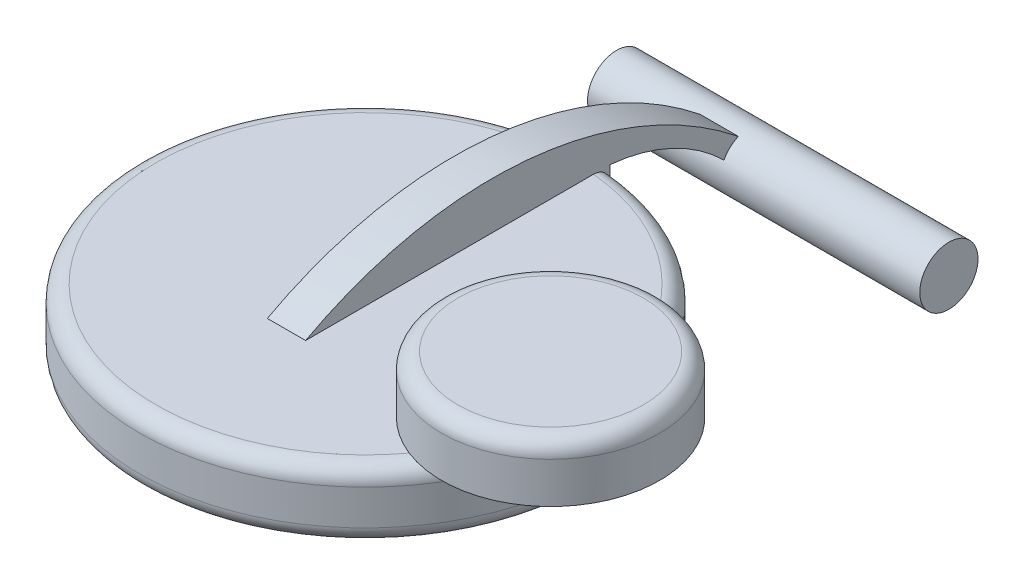
ISO-10303-21;
HEADER;
FILE_DESCRIPTION(('STEP AP214'),'2;1');
FILE_NAME('part.step','',(''),(''),'','','');
FILE_SCHEMA(('AUTOMOTIVE_DESIGN { 1 0 10303 214 1 1 1 1 }'));
ENDSEC;
DATA;
#1=APPLICATION_CONTEXT('core data for automotive mechanical design processes');
#2=APPLICATION_PROTOCOL_DEFINITION('international standard','automotive_design',2000,#1);
#3=PRODUCT_CONTEXT('',#1,'mechanical');
#4=PRODUCT('Part','Part','',(#3));
#5=PRODUCT_RELATED_PRODUCT_CATEGORY('part','',(#4));
#6=PRODUCT_DEFINITION_FORMATION('','',#4);
#7=PRODUCT_DEFINITION_CONTEXT('part definition',#1,'design');
#8=PRODUCT_DEFINITION('design','',#6,#7);
#9=PRODUCT_DEFINITION_SHAPE('','',#8);
#10=(LENGTH_UNIT() NAMED_UNIT(*) SI_UNIT(.MILLI.,.METRE.));
#11=(NAMED_UNIT(*) PLANE_ANGLE_UNIT() SI_UNIT($,.RADIAN.));
#12=(NAMED_UNIT(*) SI_UNIT($,.STERADIAN.) SOLID_ANGLE_UNIT());
#13=UNCERTAINTY_MEASURE_WITH_UNIT(LENGTH_MEASURE(1.E-05),#10,'distance_accuracy_value','');
#14=(GEOMETRIC_REPRESENTATION_CONTEXT(3) GLOBAL_UNCERTAINTY_ASSIGNED_CONTEXT((#13)) GLOBAL_UNIT_ASSIGNED_CONTEXT((#10,
#11,#12)) REPRESENTATION_CONTEXT('',''));
#15=CARTESIAN_POINT('',(0.,0.,0.));
#16=DIRECTION('',(0.,0.,1.));
#17=DIRECTION('',(1.,0.,0.));
#18=AXIS2_PLACEMENT_3D('',#15,#16,#17);
#19=CARTESIAN_POINT('',(10.3378,5.1562,34.4932));
#20=DIRECTION('',(0.,1.,0.));
#21=DIRECTION('',(0.,0.,1.));
#22=AXIS2_PLACEMENT_3D('',#19,#20,#21);
#23=PLANE('',#22);
#24=CARTESIAN_POINT('',(8.8519,5.1562,28.3464));
#25=DIRECTION('',(0.,-1.,0.));
#26=DIRECTION('',(0.,0.,-1.));
#27=AXIS2_PLACEMENT_3D('',#24,#25,#26);
#28=CIRCLE('',#27,17.5514);
#29=CARTESIAN_POINT('',(7.366,5.1562,10.8580111905642));
#30=VERTEX_POINT('',#29);
#31=CARTESIAN_POINT('',(8.8519,5.1562,10.795));
#32=VERTEX_POINT('',#31);
#33=EDGE_CURVE('E127',#30,#32,#28,.T.);
#34=ORIENTED_EDGE('',*,*,#33,.F.);
#35=DIRECTION('',(0.,0.,-1.));
#36=VECTOR('',#35,1.);
#37=CARTESIAN_POINT('',(7.366,5.1562,34.4932));
#38=LINE('',#37,#36);
#39=CARTESIAN_POINT('',(7.366,5.1562,10.795));
#40=VERTEX_POINT('',#39);
#41=EDGE_CURVE('E155',#30,#40,#38,.T.);
#42=ORIENTED_EDGE('',*,*,#41,.T.);
#43=DIRECTION('',(-1.,0.,0.));
#44=VECTOR('',#43,1.);
#45=CARTESIAN_POINT('',(10.3378,5.1562,10.795));
#46=LINE('',#45,#44);
#47=EDGE_CURVE('E152',#32,#40,#46,.T.);
#48=ORIENTED_EDGE('',*,*,#47,.F.);
#49=EDGE_LOOP('',(#34,#42,#48));
#50=FACE_BOUND('',#49,.T.);
#51=ADVANCED_FACE('F39',(#50),#23,.F.);
#52=CARTESIAN_POINT('',(25.8064,0.,0.));
#53=DIRECTION('',(-1.,0.,0.));
#54=DIRECTION('',(0.,0.,1.));
#55=AXIS2_PLACEMENT_3D('',#52,#53,#54);
#56=CYLINDRICAL_SURFACE('',#55,2.2606);
#57=CARTESIAN_POINT('',(0.,0.,0.));
#58=DIRECTION('',(1.,0.,0.));
#59=DIRECTION('',(0.,0.,-1.));
#60=AXIS2_PLACEMENT_3D('',#57,#58,#59);
#61=CIRCLE('',#60,2.2606);
#62=CARTESIAN_POINT('',(0.,0.,-2.2606));
#63=VERTEX_POINT('',#62);
#64=EDGE_CURVE('E170',#63,#63,#61,.T.);
#65=ORIENTED_EDGE('',*,*,#64,.T.);
#66=EDGE_LOOP('',(#65));
#67=FACE_BOUND('',#66,.T.);
#68=CARTESIAN_POINT('',(25.8064,0.,0.));
#69=DIRECTION('',(1.,0.,0.));
#70=DIRECTION('',(0.,0.,-1.));
#71=AXIS2_PLACEMENT_3D('',#68,#69,#70);
#72=CIRCLE('',#71,2.2606);
#73=CARTESIAN_POINT('',(25.8064,0.,-2.2606));
#74=VERTEX_POINT('',#73);
#75=EDGE_CURVE('E171',#74,#74,#72,.T.);
#76=ORIENTED_EDGE('',*,*,#75,.F.);
#77=EDGE_LOOP('',(#76));
#78=FACE_BOUND('',#77,.T.);
#79=CARTESIAN_POINT('',(10.3378,0.,0.));
#80=DIRECTION('',(-1.,0.,0.));
#81=DIRECTION('',(0.,0.,1.));
#82=AXIS2_PLACEMENT_3D('',#79,#80,#81);
#83=CIRCLE('',#82,2.2606);
#84=CARTESIAN_POINT('',(10.3378,1.04595876330423,2.00406652221604));
#85=VERTEX_POINT('',#84);
#86=CARTESIAN_POINT('',(10.3378,2.08055136158751,0.884091845792308));
#87=VERTEX_POINT('',#86);
#88=EDGE_CURVE('E189',#85,#87,#83,.T.);
#89=ORIENTED_EDGE('',*,*,#88,.F.);
#90=DIRECTION('',(-1.,0.,0.));
#91=VECTOR('',#90,1.);
#92=CARTESIAN_POINT('',(8.8519,1.04595876330423,2.00406652221604));
#93=LINE('',#92,#91);
#94=CARTESIAN_POINT('',(7.366,1.04595876330423,2.00406652221604));
#95=VERTEX_POINT('',#94);
#96=EDGE_CURVE('E182',#95,#85,#93,.F.);
#97=ORIENTED_EDGE('',*,*,#96,.F.);
#98=CARTESIAN_POINT('',(7.366,0.,0.));
#99=DIRECTION('',(-1.,0.,0.));
#100=DIRECTION('',(0.,0.,1.));
#101=AXIS2_PLACEMENT_3D('',#98,#99,#100);
#102=CIRCLE('',#101,2.2606);
#103=CARTESIAN_POINT('',(7.366,2.08055136158751,0.884091845792308));
#104=VERTEX_POINT('',#103);
#105=EDGE_CURVE('E175',#95,#104,#102,.T.);
#106=ORIENTED_EDGE('',*,*,#105,.T.);
#107=DIRECTION('',(-1.,0.,0.));
#108=VECTOR('',#107,1.);
#109=CARTESIAN_POINT('',(8.8519,2.0805513615875,0.884091845792287));
#110=LINE('',#109,#108);
#111=EDGE_CURVE('E185',#87,#104,#110,.T.);
#112=ORIENTED_EDGE('',*,*,#111,.F.);
#113=EDGE_LOOP('',(#89,#97,#106,#112));
#114=FACE_BOUND('',#113,.T.);
#115=ADVANCED_FACE('F249',(#67,#78,#114),#56,.T.);
#116=CARTESIAN_POINT('',(25.8064,0.,0.));
#117=DIRECTION('',(1.,0.,0.));
#118=DIRECTION('',(0.,0.,-1.));
#119=AXIS2_PLACEMENT_3D('',#116,#117,#118);
#120=PLANE('',#119);
#121=ORIENTED_EDGE('',*,*,#75,.T.);
#122=EDGE_LOOP('',(#121));
#123=FACE_BOUND('',#122,.T.);
#124=ADVANCED_FACE('F246',(#123),#120,.T.);
#125=CARTESIAN_POINT('',(0.,0.,0.));
#126=DIRECTION('',(1.,0.,0.));
#127=DIRECTION('',(0.,0.,-1.));
#128=AXIS2_PLACEMENT_3D('',#125,#126,#127);
#129=PLANE('',#128);
#130=ORIENTED_EDGE('',*,*,#64,.F.);
#131=EDGE_LOOP('',(#130));
#132=FACE_BOUND('',#131,.T.);
#133=ADVANCED_FACE('F244',(#132),#129,.F.);
#134=CARTESIAN_POINT('',(10.3378,-21.6891980946299,20.0046015997551));
#135=DIRECTION('',(-1.,0.,0.));
#136=DIRECTION('',(0.,0.,1.));
#137=AXIS2_PLACEMENT_3D('',#134,#135,#136);
#138=CYLINDRICAL_SURFACE('',#137,30.5056532869358);
#139=CARTESIAN_POINT('',(10.3378,-21.6891980946299,20.0046015997551));
#140=DIRECTION('',(1.,0.,0.));
#141=DIRECTION('',(0.,0.,1.));
#142=AXIS2_PLACEMENT_3D('',#139,#140,#141);
#143=CIRCLE('',#142,30.5056532869358);
#144=CARTESIAN_POINT('',(10.3378,5.1562,34.4932));
#145=VERTEX_POINT('',#144);
#146=EDGE_CURVE('E140',#87,#145,#143,.T.);
#147=ORIENTED_EDGE('',*,*,#146,.F.);
#148=ORIENTED_EDGE('',*,*,#111,.T.);
#149=CARTESIAN_POINT('',(7.366,-21.6891980946299,20.0046015997551));
#150=DIRECTION('',(1.,0.,0.));
#151=DIRECTION('',(0.,0.,1.));
#152=AXIS2_PLACEMENT_3D('',#149,#150,#151);
#153=CIRCLE('',#152,30.5056532869358);
#154=CARTESIAN_POINT('',(7.366,5.1562,34.4932));
#155=VERTEX_POINT('',#154);
#156=EDGE_CURVE('E139',#104,#155,#153,.T.);
#157=ORIENTED_EDGE('',*,*,#156,.T.);
#158=DIRECTION('',(-1.,0.,0.));
#159=VECTOR('',#158,1.);
#160=CARTESIAN_POINT('',(10.3378,5.1562,34.4932));
#161=LINE('',#160,#159);
#162=EDGE_CURVE('E166',#145,#155,#161,.T.);
#163=ORIENTED_EDGE('',*,*,#162,.F.);
#164=EDGE_LOOP('',(#147,#148,#157,#163));
#165=FACE_BOUND('',#164,.T.);
#166=ADVANCED_FACE('F237',(#165),#138,.T.);
#167=CARTESIAN_POINT('',(10.3378,-9.24301525277224,12.1710712808538));
#168=DIRECTION('',(-1.,0.,0.));
#169=DIRECTION('',(0.,0.,1.));
#170=AXIS2_PLACEMENT_3D('',#167,#168,#169);
#171=CYLINDRICAL_SURFACE('',#170,14.4648184249115);
#172=CARTESIAN_POINT('',(7.366,-9.24301525277224,12.1710712808538));
#173=DIRECTION('',(-1.,0.,0.));
#174=DIRECTION('',(0.,0.,1.));
#175=AXIS2_PLACEMENT_3D('',#172,#173,#174);
#176=CIRCLE('',#175,14.4648184249115);
#177=EDGE_CURVE('E144',#40,#95,#176,.T.);
#178=ORIENTED_EDGE('',*,*,#177,.T.);
#179=ORIENTED_EDGE('',*,*,#96,.T.);
#180=CARTESIAN_POINT('',(10.3378,-9.24301525277224,12.1710712808538));
#181=DIRECTION('',(-1.,0.,0.));
#182=DIRECTION('',(0.,0.,1.));
#183=AXIS2_PLACEMENT_3D('',#180,#181,#182);
#184=CIRCLE('',#183,14.4648184249115);
#185=CARTESIAN_POINT('',(10.3378,5.1562,10.795));
#186=VERTEX_POINT('',#185);
#187=EDGE_CURVE('E148',#186,#85,#184,.T.);
#188=ORIENTED_EDGE('',*,*,#187,.F.);
#189=EDGE_CURVE('E162',#186,#32,#46,.T.);
#190=ORIENTED_EDGE('',*,*,#189,.T.);
#191=ORIENTED_EDGE('',*,*,#47,.T.);
#192=EDGE_LOOP('',(#178,#179,#188,#190,#191));
#193=FACE_BOUND('',#192,.T.);
#194=ADVANCED_FACE('F233',(#193),#171,.F.);
#195=CARTESIAN_POINT('',(10.3378,5.1562,10.8580111905642));
#196=VERTEX_POINT('',#195);
#197=EDGE_CURVE('E136',#32,#196,#28,.T.);
#198=ORIENTED_EDGE('',*,*,#197,.F.);
#199=ORIENTED_EDGE('',*,*,#189,.F.);
#200=DIRECTION('',(0.,0.,-1.));
#201=VECTOR('',#200,1.);
#202=CARTESIAN_POINT('',(10.3378,5.1562,34.4932));
#203=LINE('',#202,#201);
#204=EDGE_CURVE('E143',#196,#186,#203,.T.);
#205=ORIENTED_EDGE('',*,*,#204,.F.);
#206=EDGE_LOOP('',(#198,#199,#205));
#207=FACE_BOUND('',#206,.T.);
#208=ADVANCED_FACE('F236',(#207),#23,.F.);
#209=CARTESIAN_POINT('',(10.3378,-21.6891980946299,20.0046015997551));
#210=DIRECTION('',(-1.,0.,0.));
#211=DIRECTION('',(0.,0.,1.));
#212=AXIS2_PLACEMENT_3D('',#209,#210,#211);
#213=PLANE('',#212);
#214=ORIENTED_EDGE('',*,*,#187,.T.);
#215=ORIENTED_EDGE('',*,*,#88,.T.);
#216=ORIENTED_EDGE('',*,*,#146,.T.);
#217=CARTESIAN_POINT('',(10.3378,5.1562,12.1329461067051));
#218=VERTEX_POINT('',#217);
#219=EDGE_CURVE('E145',#145,#218,#203,.T.);
#220=ORIENTED_EDGE('',*,*,#219,.T.);
#221=CARTESIAN_POINT('',(10.3378,5.1562,12.1329461067051));
#222=CARTESIAN_POINT('',(10.3378,5.15619968296591,12.0969700066313));
#223=CARTESIAN_POINT('',(10.3378,5.15468310840266,12.0610110663353));
#224=CARTESIAN_POINT('',(10.3378,5.14863183837985,11.9893494427178));
#225=CARTESIAN_POINT('',(10.3378,5.14409725487163,11.9536467499407));
#226=CARTESIAN_POINT('',(10.3378,5.12600630743825,11.8473599921958));
#227=CARTESIAN_POINT('',(10.3378,5.10796264430648,11.7774862704339));
#228=CARTESIAN_POINT('',(10.3378,5.06039429879518,11.6417596208282));
#229=CARTESIAN_POINT('',(10.3378,5.03086349611299,11.5759088580778));
#230=CARTESIAN_POINT('',(10.3378,4.96114685399675,11.4501180087452));
#231=CARTESIAN_POINT('',(10.3378,4.92096330699357,11.3901766542831));
#232=CARTESIAN_POINT('',(10.3378,4.8311625796018,11.2780437135222));
#233=CARTESIAN_POINT('',(10.3378,4.78156527032259,11.2258362082136));
#234=CARTESIAN_POINT('',(10.3378,4.67426825521768,11.1305151448364));
#235=CARTESIAN_POINT('',(10.3378,4.61656701531734,11.0874033124547));
#236=CARTESIAN_POINT('',(10.3378,4.49493449114163,11.0116750623712));
#237=CARTESIAN_POINT('',(10.3378,4.43102576432908,10.9790223689798));
#238=CARTESIAN_POINT('',(10.3378,4.29863509627014,10.9249669040521));
#239=CARTESIAN_POINT('',(10.3378,4.2301561048073,10.9035569537673));
#240=CARTESIAN_POINT('',(10.3378,4.11539375948189,10.8780831511528));
#241=CARTESIAN_POINT('',(10.3378,4.0698485324604,10.8705606426928));
#242=CARTESIAN_POINT('',(10.3378,3.9782754122449,10.8605254847069));
#243=CARTESIAN_POINT('',(10.3378,3.93224830061493,10.8580057009882));
#244=CARTESIAN_POINT('',(10.3378,3.8862,10.8580111905642));
#245=B_SPLINE_CURVE_WITH_KNOTS('',3,(#221,#222,#223,#224,#225,#226,#227,#228,#229,#230,#231,
#232,#233,#234,#235,#236,#237,#238,#239,#240,#241,#242,#243,#244),.UNSPECIFIED.,.F.,.F.,(4,2,2,
2,2,2,2,2,2,2,2,4),(0.,0.107862213878762,0.215720426892903,0.431108148986637,0.646610786340875,
0.86206708592288,1.07707354657079,1.2921207629531,1.50641384029011,1.72056991970458,
1.8588019132993,1.99683663757926),.UNSPECIFIED.);
#246=CARTESIAN_POINT('',(10.3378,3.8862,10.8580111905642));
#247=VERTEX_POINT('',#246);
#248=EDGE_CURVE('E111',#218,#247,#245,.T.);
#249=ORIENTED_EDGE('',*,*,#248,.T.);
#250=DIRECTION('',(0.,1.,0.));
#251=VECTOR('',#250,1.);
#252=CARTESIAN_POINT('',(10.3378,5.1562,10.8580111905642));
#253=LINE('',#252,#251);
#254=EDGE_CURVE('E63',#196,#247,#253,.F.);
#255=ORIENTED_EDGE('',*,*,#254,.F.);
#256=ORIENTED_EDGE('',*,*,#204,.T.);
#257=EDGE_LOOP('',(#214,#215,#216,#220,#249,#255,#256));
#258=FACE_BOUND('',#257,.T.);
#259=ADVANCED_FACE('F229',(#258),#213,.F.);
#260=CARTESIAN_POINT('',(7.366,-21.6891980946299,20.0046015997551));
#261=DIRECTION('',(-1.,0.,0.));
#262=DIRECTION('',(0.,0.,1.));
#263=AXIS2_PLACEMENT_3D('',#260,#261,#262);
#264=PLANE('',#263);
#265=ORIENTED_EDGE('',*,*,#105,.F.);
#266=ORIENTED_EDGE('',*,*,#177,.F.);
#267=ORIENTED_EDGE('',*,*,#41,.F.);
#268=DIRECTION('',(0.,1.,0.));
#269=VECTOR('',#268,1.);
#270=CARTESIAN_POINT('',(7.366,3.8862,10.8580111905642));
#271=LINE('',#270,#269);
#272=CARTESIAN_POINT('',(7.366,3.8862,10.8580111905642));
#273=VERTEX_POINT('',#272);
#274=EDGE_CURVE('E116',#273,#30,#271,.T.);
#275=ORIENTED_EDGE('',*,*,#274,.F.);
#276=CARTESIAN_POINT('',(7.366,3.8862,10.8580111905642));
#277=CARTESIAN_POINT('',(7.366,3.9218358775204,10.8580113648934));
#278=CARTESIAN_POINT('',(7.366,3.95745465250052,10.8595174451994));
#279=CARTESIAN_POINT('',(7.366,4.02843664619621,10.8655253835975));
#280=CARTESIAN_POINT('',(7.366,4.06379987877563,10.8700270779174));
#281=CARTESIAN_POINT('',(7.366,4.16905749695984,10.8879808637797));
#282=CARTESIAN_POINT('',(7.366,4.23824573712345,10.9058817883599));
#283=CARTESIAN_POINT('',(7.366,4.37263117566729,10.9530409650735));
#284=CARTESIAN_POINT('',(7.366,4.43782657414642,10.9823042961789));
#285=CARTESIAN_POINT('',(7.366,4.56238863476353,11.05134234274));
#286=CARTESIAN_POINT('',(7.366,4.62175616438346,11.0911154905393));
#287=CARTESIAN_POINT('',(7.366,4.73307918265103,11.1801008186549));
#288=CARTESIAN_POINT('',(7.366,4.78502337596681,11.2293271216766));
#289=CARTESIAN_POINT('',(7.366,4.87995503951322,11.3357862517968));
#290=CARTESIAN_POINT('',(7.366,4.92294071490259,11.3930206794934));
#291=CARTESIAN_POINT('',(7.366,4.99888701390576,11.5140760828271));
#292=CARTESIAN_POINT('',(7.366,5.03181080543425,11.577920138665));
#293=CARTESIAN_POINT('',(7.366,5.08650099695432,11.7102044956973));
#294=CARTESIAN_POINT('',(7.366,5.10827325870232,11.7786423607314));
#295=CARTESIAN_POINT('',(7.366,5.1348187513842,11.8950497862406));
#296=CARTESIAN_POINT('',(7.366,5.14283220925078,11.9423063842378));
#297=CARTESIAN_POINT('',(7.366,5.15352224994666,12.0373510228593));
#298=CARTESIAN_POINT('',(7.366,5.15620642730689,12.0851382094959));
#299=CARTESIAN_POINT('',(7.366,5.1562,12.1329461067051));
#300=B_SPLINE_CURVE_WITH_KNOTS('',3,(#276,#277,#278,#279,#280,#281,#282,#283,#284,#285,#286,
#287,#288,#289,#290,#291,#292,#293,#294,#295,#296,#297,#298,#299),.UNSPECIFIED.,.F.,.F.,(4,2,2,
2,2,2,2,2,2,2,2,4),(0.,0.106841862696395,0.213677884756982,0.426976942770503,0.640371454982365,
0.853734154969043,1.06741812719561,1.28114486998918,1.49564485067889,1.71003196431069,
1.85354464954252,1.99685267374062),.UNSPECIFIED.);
#301=CARTESIAN_POINT('',(7.366,5.1562,12.1329461067051));
#302=VERTEX_POINT('',#301);
#303=EDGE_CURVE('E209',#273,#302,#300,.T.);
#304=ORIENTED_EDGE('',*,*,#303,.T.);
#305=EDGE_CURVE('E156',#155,#302,#38,.T.);
#306=ORIENTED_EDGE('',*,*,#305,.F.);
#307=ORIENTED_EDGE('',*,*,#156,.F.);
#308=EDGE_LOOP('',(#265,#266,#267,#275,#304,#306,#307));
#309=FACE_BOUND('',#308,.T.);
#310=ADVANCED_FACE('F225',(#309),#264,.T.);
#311=CARTESIAN_POINT('',(8.8519,5.1562,28.3464));
#312=DIRECTION('',(0.,-1.,0.));
#313=DIRECTION('',(0.,0.,-1.));
#314=AXIS2_PLACEMENT_3D('',#311,#312,#313);
#315=PLANE('',#314);
#316=CARTESIAN_POINT('',(25.0322338989841,5.1562,30.1576925985014));
#317=DIRECTION('',(0.,1.,0.));
#318=DIRECTION('',(0.,0.,1.));
#319=AXIS2_PLACEMENT_3D('',#316,#317,#318);
#320=CIRCLE('',#319,8.4709);
#321=CARTESIAN_POINT('',(23.7522248016217,5.1562,21.7840599626217));
#322=VERTEX_POINT('',#321);
#323=CARTESIAN_POINT('',(21.9323540698781,5.1562,38.0410225963577));
#324=VERTEX_POINT('',#323);
#325=EDGE_CURVE('E120',#322,#324,#320,.T.);
#326=ORIENTED_EDGE('',*,*,#325,.F.);
#327=CARTESIAN_POINT('',(8.8519,5.1562,28.3464));
#328=DIRECTION('',(0.,-1.,0.));
#329=DIRECTION('',(0.,0.,-1.));
#330=AXIS2_PLACEMENT_3D('',#327,#328,#329);
#331=CIRCLE('',#330,16.2814);
#332=EDGE_CURVE('E107',#322,#218,#331,.F.);
#333=ORIENTED_EDGE('',*,*,#332,.T.);
#334=ORIENTED_EDGE('',*,*,#219,.F.);
#335=ORIENTED_EDGE('',*,*,#162,.T.);
#336=ORIENTED_EDGE('',*,*,#305,.T.);
#337=EDGE_CURVE('E118',#302,#324,#331,.F.);
#338=ORIENTED_EDGE('',*,*,#337,.T.);
#339=EDGE_LOOP('',(#326,#333,#334,#335,#336,#338));
#340=FACE_BOUND('',#339,.T.);
#341=ADVANCED_FACE('F121',(#340),#315,.F.);
#342=CARTESIAN_POINT('',(8.8519,-0.127,28.3464));
#343=DIRECTION('',(0.,1.,0.));
#344=DIRECTION('',(0.,0.,1.));
#345=AXIS2_PLACEMENT_3D('',#342,#343,#344);
#346=CYLINDRICAL_SURFACE('',#345,17.5514);
#347=CARTESIAN_POINT('',(8.8519,1.143,28.3464));
#348=DIRECTION('',(0.,-1.,0.));
#349=DIRECTION('',(0.,0.,-1.));
#350=AXIS2_PLACEMENT_3D('',#347,#348,#349);
#351=CIRCLE('',#350,17.5514);
#352=CARTESIAN_POINT('',(8.8519,1.143,10.795));
#353=VERTEX_POINT('',#352);
#354=EDGE_CURVE('E192',#353,#353,#351,.F.);
#355=ORIENTED_EDGE('',*,*,#354,.T.);
#356=EDGE_LOOP('',(#355));
#357=FACE_BOUND('',#356,.T.);
#358=CARTESIAN_POINT('',(8.8519,3.8862,28.3464));
#359=DIRECTION('',(0.,-1.,0.));
#360=DIRECTION('',(0.,0.,-1.));
#361=AXIS2_PLACEMENT_3D('',#358,#359,#360);
#362=CIRCLE('',#361,17.5514);
#363=EDGE_CURVE('E198',#247,#273,#362,.T.);
#364=ORIENTED_EDGE('',*,*,#363,.T.);
#365=ORIENTED_EDGE('',*,*,#274,.T.);
#366=ORIENTED_EDGE('',*,*,#33,.T.);
#367=ORIENTED_EDGE('',*,*,#197,.T.);
#368=ORIENTED_EDGE('',*,*,#254,.T.);
#369=EDGE_LOOP('',(#364,#365,#366,#367,#368));
#370=FACE_BOUND('',#369,.T.);
#371=ADVANCED_FACE('F272',(#357,#370),#346,.T.);
#372=CARTESIAN_POINT('',(8.8519,-0.127,28.3464));
#373=DIRECTION('',(0.,-1.,0.));
#374=DIRECTION('',(0.,0.,-1.));
#375=AXIS2_PLACEMENT_3D('',#372,#373,#374);
#376=PLANE('',#375);
#377=CARTESIAN_POINT('',(8.8519,-0.127,28.3464));
#378=DIRECTION('',(0.,-1.,0.));
#379=DIRECTION('',(0.,0.,-1.));
#380=AXIS2_PLACEMENT_3D('',#377,#378,#379);
#381=CIRCLE('',#380,16.2814);
#382=CARTESIAN_POINT('',(8.8519,-0.126999999999999,12.065));
#383=VERTEX_POINT('',#382);
#384=EDGE_CURVE('E205',#383,#383,#381,.T.);
#385=ORIENTED_EDGE('',*,*,#384,.T.);
#386=EDGE_LOOP('',(#385));
#387=FACE_BOUND('',#386,.T.);
#388=ADVANCED_FACE('F309',(#387),#376,.T.);
#389=CARTESIAN_POINT('',(8.8519,3.8862,28.3464));
#390=DIRECTION('',(0.,-1.,0.));
#391=DIRECTION('',(0.,0.,-1.));
#392=AXIS2_PLACEMENT_3D('',#389,#390,#391);
#393=TOROIDAL_SURFACE('',#392,16.2814,1.27);
#394=ORIENTED_EDGE('',*,*,#248,.F.);
#395=ORIENTED_EDGE('',*,*,#332,.F.);
#396=EDGE_CURVE('E55',#324,#322,#331,.F.);
#397=ORIENTED_EDGE('',*,*,#396,.F.);
#398=ORIENTED_EDGE('',*,*,#337,.F.);
#399=ORIENTED_EDGE('',*,*,#303,.F.);
#400=ORIENTED_EDGE('',*,*,#363,.F.);
#401=EDGE_LOOP('',(#394,#395,#397,#398,#399,#400));
#402=FACE_BOUND('',#401,.T.);
#403=ADVANCED_FACE('F109',(#402),#393,.T.);
#404=CARTESIAN_POINT('',(8.8519,1.143,28.3464));
#405=DIRECTION('',(0.,-1.,0.));
#406=DIRECTION('',(0.,0.,-1.));
#407=AXIS2_PLACEMENT_3D('',#404,#405,#406);
#408=TOROIDAL_SURFACE('',#407,16.2814,1.27);
#409=ORIENTED_EDGE('',*,*,#354,.F.);
#410=EDGE_LOOP('',(#409));
#411=FACE_BOUND('',#410,.T.);
#412=ORIENTED_EDGE('',*,*,#384,.F.);
#413=EDGE_LOOP('',(#412));
#414=FACE_BOUND('',#413,.T.);
#415=ADVANCED_FACE('F300',(#411,#414),#408,.T.);
#416=CARTESIAN_POINT('',(25.0322338989841,9.6012,30.1576925985014));
#417=DIRECTION('',(0.,-1.,0.));
#418=DIRECTION('',(0.,0.,-1.));
#419=AXIS2_PLACEMENT_3D('',#416,#417,#418);
#420=CYLINDRICAL_SURFACE('',#419,8.4709);
#421=CARTESIAN_POINT('',(25.0322338989841,8.3312,30.1576925985014));
#422=DIRECTION('',(0.,1.,0.));
#423=DIRECTION('',(0.,0.,1.));
#424=AXIS2_PLACEMENT_3D('',#421,#422,#423);
#425=CIRCLE('',#424,8.4709);
#426=CARTESIAN_POINT('',(25.0322338989841,8.3312,38.6285925985014));
#427=VERTEX_POINT('',#426);
#428=EDGE_CURVE('E11',#427,#427,#425,.F.);
#429=ORIENTED_EDGE('',*,*,#428,.T.);
#430=EDGE_LOOP('',(#429));
#431=FACE_BOUND('',#430,.T.);
#432=ORIENTED_EDGE('',*,*,#325,.T.);
#433=EDGE_CURVE('E128',#324,#322,#320,.T.);
#434=ORIENTED_EDGE('',*,*,#433,.T.);
#435=EDGE_LOOP('',(#432,#434));
#436=FACE_BOUND('',#435,.T.);
#437=ADVANCED_FACE('F133',(#431,#436),#420,.T.);
#438=CARTESIAN_POINT('',(25.0322338989841,9.6012,30.1576925985014));
#439=DIRECTION('',(0.,1.,0.));
#440=DIRECTION('',(0.,0.,1.));
#441=AXIS2_PLACEMENT_3D('',#438,#439,#440);
#442=PLANE('',#441);
#443=CARTESIAN_POINT('',(25.0322338989841,9.6012,30.1576925985014));
#444=DIRECTION('',(0.,1.,0.));
#445=DIRECTION('',(0.,0.,1.));
#446=AXIS2_PLACEMENT_3D('',#443,#444,#445);
#447=CIRCLE('',#446,7.2009);
#448=CARTESIAN_POINT('',(25.0322338989841,9.6012,37.3585925985014));
#449=VERTEX_POINT('',#448);
#450=EDGE_CURVE('E48',#449,#449,#447,.T.);
#451=ORIENTED_EDGE('',*,*,#450,.T.);
#452=EDGE_LOOP('',(#451));
#453=FACE_BOUND('',#452,.T.);
#454=ADVANCED_FACE('F289',(#453),#442,.T.);
#455=CARTESIAN_POINT('',(25.0322338989841,5.1562,30.1576925985014));
#456=DIRECTION('',(0.,1.,0.));
#457=DIRECTION('',(0.,0.,1.));
#458=AXIS2_PLACEMENT_3D('',#455,#456,#457);
#459=PLANE('',#458);
#460=ORIENTED_EDGE('',*,*,#433,.F.);
#461=ORIENTED_EDGE('',*,*,#396,.T.);
#462=EDGE_LOOP('',(#460,#461));
#463=FACE_BOUND('',#462,.T.);
#464=ADVANCED_FACE('F131',(#463),#459,.F.);
#465=CARTESIAN_POINT('',(25.0322338989841,8.3312,30.1576925985014));
#466=DIRECTION('',(0.,1.,0.));
#467=DIRECTION('',(0.,0.,1.));
#468=AXIS2_PLACEMENT_3D('',#465,#466,#467);
#469=TOROIDAL_SURFACE('',#468,7.2009,1.27);
#470=ORIENTED_EDGE('',*,*,#428,.F.);
#471=EDGE_LOOP('',(#470));
#472=FACE_BOUND('',#471,.T.);
#473=ORIENTED_EDGE('',*,*,#450,.F.);
#474=EDGE_LOOP('',(#473));
#475=FACE_BOUND('',#474,.T.);
#476=ADVANCED_FACE('F41',(#472,#475),#469,.T.);
#477=CLOSED_SHELL('',(#51,#115,#124,#133,#166,#194,#208,#259,#310,#341,#371,#388,#403,#415,#437,
#454,#464,#476));
#478=MANIFOLD_SOLID_BREP('B2',#477);
#479=ADVANCED_BREP_SHAPE_REPRESENTATION('',(#18,#478),#14);
#480=SHAPE_DEFINITION_REPRESENTATION(#9,#479);
ENDSEC;
END-ISO-10303-21;
